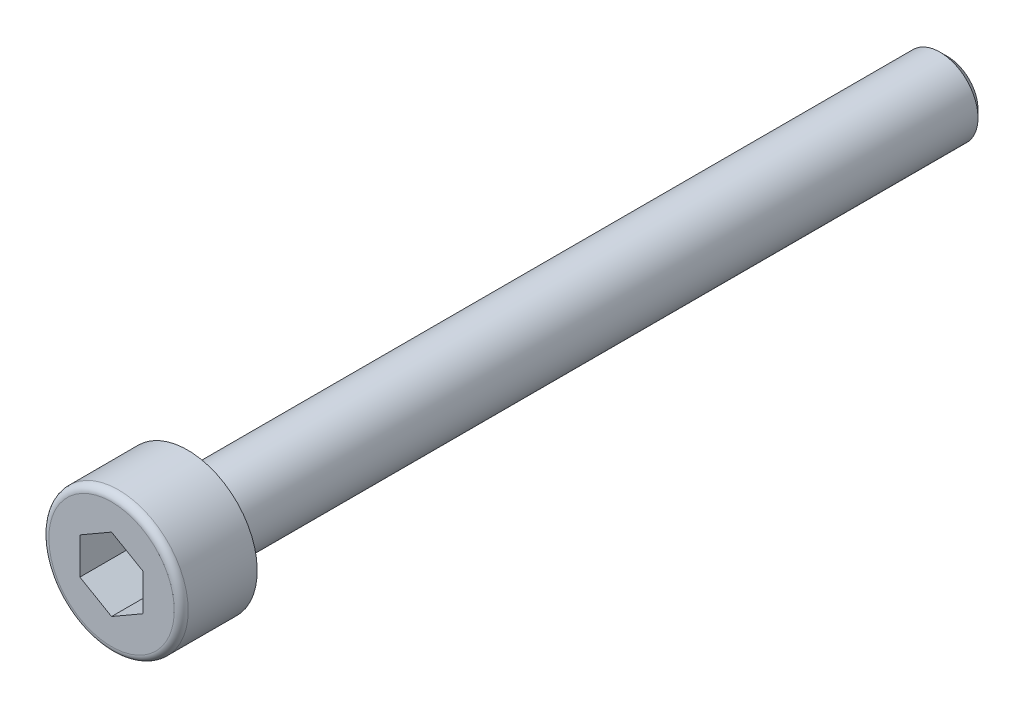
ISO-10303-21;
HEADER;
FILE_DESCRIPTION(('STEP AP214'),'2;1');
FILE_NAME('part.step','',(''),(''),'','','');
FILE_SCHEMA(('AUTOMOTIVE_DESIGN { 1 0 10303 214 1 1 1 1 }'));
ENDSEC;
DATA;
#1=APPLICATION_CONTEXT('core data for automotive mechanical design processes');
#2=APPLICATION_PROTOCOL_DEFINITION('international standard','automotive_design',2000,#1);
#3=PRODUCT_CONTEXT('',#1,'mechanical');
#4=PRODUCT('Part','Part','',(#3));
#5=PRODUCT_RELATED_PRODUCT_CATEGORY('part','',(#4));
#6=PRODUCT_DEFINITION_FORMATION('','',#4);
#7=PRODUCT_DEFINITION_CONTEXT('part definition',#1,'design');
#8=PRODUCT_DEFINITION('design','',#6,#7);
#9=PRODUCT_DEFINITION_SHAPE('','',#8);
#10=(LENGTH_UNIT() NAMED_UNIT(*) SI_UNIT(.MILLI.,.METRE.));
#11=(NAMED_UNIT(*) PLANE_ANGLE_UNIT() SI_UNIT($,.RADIAN.));
#12=(NAMED_UNIT(*) SI_UNIT($,.STERADIAN.) SOLID_ANGLE_UNIT());
#13=UNCERTAINTY_MEASURE_WITH_UNIT(LENGTH_MEASURE(1.E-05),#10,'distance_accuracy_value','');
#14=(GEOMETRIC_REPRESENTATION_CONTEXT(3) GLOBAL_UNCERTAINTY_ASSIGNED_CONTEXT((#13)) GLOBAL_UNIT_ASSIGNED_CONTEXT((#10,
#11,#12)) REPRESENTATION_CONTEXT('',''));
#15=CARTESIAN_POINT('',(0.,0.,0.));
#16=DIRECTION('',(0.,0.,1.));
#17=DIRECTION('',(1.,0.,0.));
#18=AXIS2_PLACEMENT_3D('',#15,#16,#17);
#19=CARTESIAN_POINT('',(0.,0.,3.));
#20=DIRECTION('',(0.,0.,-1.));
#21=DIRECTION('',(0.,1.,0.));
#22=AXIS2_PLACEMENT_3D('',#19,#20,#21);
#23=PLANE('',#22);
#24=CARTESIAN_POINT('',(0.,0.,3.));
#25=DIRECTION('',(0.,0.,-1.));
#26=DIRECTION('',(0.,1.,0.));
#27=AXIS2_PLACEMENT_3D('',#24,#25,#26);
#28=CIRCLE('',#27,2.475);
#29=CARTESIAN_POINT('',(0.,2.475,3.));
#30=VERTEX_POINT('',#29);
#31=EDGE_CURVE('E159',#30,#30,#28,.F.);
#32=ORIENTED_EDGE('',*,*,#31,.T.);
#33=EDGE_LOOP('',(#32));
#34=FACE_BOUND('',#33,.T.);
#35=DIRECTION('',(-0.866025403784439,-0.5,0.));
#36=VECTOR('',#35,1.);
#37=CARTESIAN_POINT('',(0.,1.44337567297406,3.));
#38=LINE('',#37,#36);
#39=CARTESIAN_POINT('',(0.,1.44337567297406,3.));
#40=VERTEX_POINT('',#39);
#41=CARTESIAN_POINT('',(-1.25,0.721687836487032,3.));
#42=VERTEX_POINT('',#41);
#43=EDGE_CURVE('E135',#40,#42,#38,.T.);
#44=ORIENTED_EDGE('',*,*,#43,.F.);
#45=DIRECTION('',(-0.866025403784439,0.5,0.));
#46=VECTOR('',#45,1.);
#47=CARTESIAN_POINT('',(1.25,0.721687836487032,3.));
#48=LINE('',#47,#46);
#49=CARTESIAN_POINT('',(1.25,0.721687836487032,3.));
#50=VERTEX_POINT('',#49);
#51=EDGE_CURVE('E61',#50,#40,#48,.T.);
#52=ORIENTED_EDGE('',*,*,#51,.F.);
#53=DIRECTION('',(0.,1.,0.));
#54=VECTOR('',#53,1.);
#55=CARTESIAN_POINT('',(1.25,-0.721687836487032,3.));
#56=LINE('',#55,#54);
#57=CARTESIAN_POINT('',(1.25,-0.721687836487032,3.));
#58=VERTEX_POINT('',#57);
#59=EDGE_CURVE('E144',#58,#50,#56,.T.);
#60=ORIENTED_EDGE('',*,*,#59,.F.);
#61=DIRECTION('',(0.866025403784439,0.5,0.));
#62=VECTOR('',#61,1.);
#63=CARTESIAN_POINT('',(0.,-1.44337567297406,3.));
#64=LINE('',#63,#62);
#65=CARTESIAN_POINT('',(0.,-1.44337567297406,3.));
#66=VERTEX_POINT('',#65);
#67=EDGE_CURVE('E142',#66,#58,#64,.T.);
#68=ORIENTED_EDGE('',*,*,#67,.F.);
#69=DIRECTION('',(0.866025403784439,-0.5,0.));
#70=VECTOR('',#69,1.);
#71=CARTESIAN_POINT('',(-1.25,-0.721687836487033,3.));
#72=LINE('',#71,#70);
#73=CARTESIAN_POINT('',(-1.25,-0.721687836487033,3.));
#74=VERTEX_POINT('',#73);
#75=EDGE_CURVE('E109',#74,#66,#72,.T.);
#76=ORIENTED_EDGE('',*,*,#75,.F.);
#77=DIRECTION('',(0.,-1.,0.));
#78=VECTOR('',#77,1.);
#79=CARTESIAN_POINT('',(-1.25,0.721687836487032,3.));
#80=LINE('',#79,#78);
#81=EDGE_CURVE('E138',#42,#74,#80,.T.);
#82=ORIENTED_EDGE('',*,*,#81,.F.);
#83=EDGE_LOOP('',(#44,#52,#60,#68,#76,#82));
#84=FACE_BOUND('',#83,.T.);
#85=ADVANCED_FACE('F46',(#34,#84),#23,.F.);
#86=CARTESIAN_POINT('',(0.,0.,3.));
#87=DIRECTION('',(0.,0.,1.));
#88=DIRECTION('',(0.,-1.,0.));
#89=AXIS2_PLACEMENT_3D('',#86,#87,#88);
#90=CYLINDRICAL_SURFACE('',#89,2.75);
#91=CARTESIAN_POINT('',(0.,0.,2.725));
#92=DIRECTION('',(0.,0.,-1.));
#93=DIRECTION('',(0.,1.,0.));
#94=AXIS2_PLACEMENT_3D('',#91,#92,#93);
#95=CIRCLE('',#94,2.75);
#96=CARTESIAN_POINT('',(0.,2.75,2.725));
#97=VERTEX_POINT('',#96);
#98=EDGE_CURVE('E162',#97,#97,#95,.T.);
#99=ORIENTED_EDGE('',*,*,#98,.T.);
#100=EDGE_LOOP('',(#99));
#101=FACE_BOUND('',#100,.T.);
#102=CARTESIAN_POINT('',(0.,0.,0.));
#103=DIRECTION('',(0.,0.,1.));
#104=DIRECTION('',(0.,-1.,0.));
#105=AXIS2_PLACEMENT_3D('',#102,#103,#104);
#106=CIRCLE('',#105,2.75);
#107=CARTESIAN_POINT('',(0.,-2.75,0.));
#108=VERTEX_POINT('',#107);
#109=EDGE_CURVE('E156',#108,#108,#106,.T.);
#110=ORIENTED_EDGE('',*,*,#109,.T.);
#111=EDGE_LOOP('',(#110));
#112=FACE_BOUND('',#111,.T.);
#113=ADVANCED_FACE('F180',(#101,#112),#90,.T.);
#114=CARTESIAN_POINT('',(0.,2.75,0.));
#115=DIRECTION('',(0.,0.,1.));
#116=DIRECTION('',(0.,-1.,0.));
#117=AXIS2_PLACEMENT_3D('',#114,#115,#116);
#118=PLANE('',#117);
#119=ORIENTED_EDGE('',*,*,#109,.F.);
#120=EDGE_LOOP('',(#119));
#121=FACE_BOUND('',#120,.T.);
#122=CARTESIAN_POINT('',(0.,0.,0.));
#123=DIRECTION('',(0.,0.,1.));
#124=DIRECTION('',(0.,-1.,0.));
#125=AXIS2_PLACEMENT_3D('',#122,#123,#124);
#126=CIRCLE('',#125,1.5);
#127=CARTESIAN_POINT('',(0.,-1.5,0.));
#128=VERTEX_POINT('',#127);
#129=EDGE_CURVE('E148',#128,#128,#126,.T.);
#130=ORIENTED_EDGE('',*,*,#129,.T.);
#131=EDGE_LOOP('',(#130));
#132=FACE_BOUND('',#131,.T.);
#133=ADVANCED_FACE('F187',(#121,#132),#118,.F.);
#134=CARTESIAN_POINT('',(0.,0.,3.));
#135=DIRECTION('',(0.,0.,1.));
#136=DIRECTION('',(0.,-1.,0.));
#137=AXIS2_PLACEMENT_3D('',#134,#135,#136);
#138=CYLINDRICAL_SURFACE('',#137,1.5);
#139=CARTESIAN_POINT('',(0.,0.,-29.7));
#140=DIRECTION('',(0.,0.,1.));
#141=DIRECTION('',(0.,-1.,0.));
#142=AXIS2_PLACEMENT_3D('',#139,#140,#141);
#143=CIRCLE('',#142,1.5);
#144=CARTESIAN_POINT('',(0.,-1.5,-29.7));
#145=VERTEX_POINT('',#144);
#146=EDGE_CURVE('E54',#145,#145,#143,.T.);
#147=ORIENTED_EDGE('',*,*,#146,.T.);
#148=EDGE_LOOP('',(#147));
#149=FACE_BOUND('',#148,.T.);
#150=ORIENTED_EDGE('',*,*,#129,.F.);
#151=EDGE_LOOP('',(#150));
#152=FACE_BOUND('',#151,.T.);
#153=ADVANCED_FACE('F167',(#149,#152),#138,.T.);
#154=CARTESIAN_POINT('',(0.,1.5,-30.));
#155=DIRECTION('',(0.,0.,1.));
#156=DIRECTION('',(0.,-1.,0.));
#157=AXIS2_PLACEMENT_3D('',#154,#155,#156);
#158=PLANE('',#157);
#159=CARTESIAN_POINT('',(0.,0.,-30.));
#160=DIRECTION('',(0.,0.,1.));
#161=DIRECTION('',(0.,-1.,0.));
#162=AXIS2_PLACEMENT_3D('',#159,#160,#161);
#163=CIRCLE('',#162,1.20000000000001);
#164=CARTESIAN_POINT('',(0.,-1.20000000000001,-30.));
#165=VERTEX_POINT('',#164);
#166=EDGE_CURVE('E11',#165,#165,#163,.F.);
#167=ORIENTED_EDGE('',*,*,#166,.T.);
#168=EDGE_LOOP('',(#167));
#169=FACE_BOUND('',#168,.T.);
#170=ADVANCED_FACE('F197',(#169),#158,.F.);
#171=CARTESIAN_POINT('',(1.25,0.721687836487032,1.075));
#172=DIRECTION('',(0.5,0.866025403784439,0.));
#173=DIRECTION('',(-0.866025403784439,0.5,0.));
#174=AXIS2_PLACEMENT_3D('',#171,#172,#173);
#175=PLANE('',#174);
#176=ORIENTED_EDGE('',*,*,#51,.T.);
#177=DIRECTION('',(0.,0.,1.));
#178=VECTOR('',#177,1.);
#179=CARTESIAN_POINT('',(0.,1.44337567297406,1.075));
#180=LINE('',#179,#178);
#181=CARTESIAN_POINT('',(0.,1.44337567297406,1.075));
#182=VERTEX_POINT('',#181);
#183=EDGE_CURVE('E91',#182,#40,#180,.T.);
#184=ORIENTED_EDGE('',*,*,#183,.F.);
#185=DIRECTION('',(-0.866025403784439,0.5,0.));
#186=VECTOR('',#185,1.);
#187=CARTESIAN_POINT('',(1.25,0.721687836487032,1.075));
#188=LINE('',#187,#186);
#189=CARTESIAN_POINT('',(1.25,0.721687836487032,1.075));
#190=VERTEX_POINT('',#189);
#191=EDGE_CURVE('E146',#190,#182,#188,.T.);
#192=ORIENTED_EDGE('',*,*,#191,.F.);
#193=DIRECTION('',(0.,0.,1.));
#194=VECTOR('',#193,1.);
#195=CARTESIAN_POINT('',(1.25,0.721687836487032,1.075));
#196=LINE('',#195,#194);
#197=EDGE_CURVE('E69',#190,#50,#196,.T.);
#198=ORIENTED_EDGE('',*,*,#197,.T.);
#199=EDGE_LOOP('',(#176,#184,#192,#198));
#200=FACE_BOUND('',#199,.T.);
#201=ADVANCED_FACE('F199',(#200),#175,.F.);
#202=CARTESIAN_POINT('',(1.25,-0.721687836487032,1.075));
#203=DIRECTION('',(1.,0.,0.));
#204=DIRECTION('',(0.,0.,-1.));
#205=AXIS2_PLACEMENT_3D('',#202,#203,#204);
#206=PLANE('',#205);
#207=ORIENTED_EDGE('',*,*,#59,.T.);
#208=ORIENTED_EDGE('',*,*,#197,.F.);
#209=DIRECTION('',(0.,1.,0.));
#210=VECTOR('',#209,1.);
#211=CARTESIAN_POINT('',(1.25,-0.721687836487032,1.075));
#212=LINE('',#211,#210);
#213=CARTESIAN_POINT('',(1.25,-0.721687836487032,1.075));
#214=VERTEX_POINT('',#213);
#215=EDGE_CURVE('E121',#214,#190,#212,.T.);
#216=ORIENTED_EDGE('',*,*,#215,.F.);
#217=DIRECTION('',(0.,0.,1.));
#218=VECTOR('',#217,1.);
#219=CARTESIAN_POINT('',(1.25,-0.721687836487032,1.075));
#220=LINE('',#219,#218);
#221=EDGE_CURVE('E113',#214,#58,#220,.T.);
#222=ORIENTED_EDGE('',*,*,#221,.T.);
#223=EDGE_LOOP('',(#207,#208,#216,#222));
#224=FACE_BOUND('',#223,.T.);
#225=ADVANCED_FACE('F203',(#224),#206,.F.);
#226=CARTESIAN_POINT('',(0.,-1.44337567297406,1.075));
#227=DIRECTION('',(0.5,-0.866025403784439,0.));
#228=DIRECTION('',(0.866025403784439,0.5,0.));
#229=AXIS2_PLACEMENT_3D('',#226,#227,#228);
#230=PLANE('',#229);
#231=ORIENTED_EDGE('',*,*,#67,.T.);
#232=ORIENTED_EDGE('',*,*,#221,.F.);
#233=DIRECTION('',(0.866025403784439,0.5,0.));
#234=VECTOR('',#233,1.);
#235=CARTESIAN_POINT('',(0.,-1.44337567297406,1.075));
#236=LINE('',#235,#234);
#237=CARTESIAN_POINT('',(0.,-1.44337567297406,1.075));
#238=VERTEX_POINT('',#237);
#239=EDGE_CURVE('E117',#238,#214,#236,.T.);
#240=ORIENTED_EDGE('',*,*,#239,.F.);
#241=DIRECTION('',(0.,0.,1.));
#242=VECTOR('',#241,1.);
#243=CARTESIAN_POINT('',(0.,-1.44337567297406,1.075));
#244=LINE('',#243,#242);
#245=EDGE_CURVE('E102',#238,#66,#244,.T.);
#246=ORIENTED_EDGE('',*,*,#245,.T.);
#247=EDGE_LOOP('',(#231,#232,#240,#246));
#248=FACE_BOUND('',#247,.T.);
#249=ADVANCED_FACE('F118',(#248),#230,.F.);
#250=CARTESIAN_POINT('',(-1.25,-0.721687836487033,1.075));
#251=DIRECTION('',(-0.5,-0.866025403784439,0.));
#252=DIRECTION('',(0.866025403784439,-0.5,0.));
#253=AXIS2_PLACEMENT_3D('',#250,#251,#252);
#254=PLANE('',#253);
#255=ORIENTED_EDGE('',*,*,#75,.T.);
#256=ORIENTED_EDGE('',*,*,#245,.F.);
#257=DIRECTION('',(0.866025403784439,-0.5,0.));
#258=VECTOR('',#257,1.);
#259=CARTESIAN_POINT('',(-1.25,-0.721687836487033,1.075));
#260=LINE('',#259,#258);
#261=CARTESIAN_POINT('',(-1.25,-0.721687836487033,1.075));
#262=VERTEX_POINT('',#261);
#263=EDGE_CURVE('E106',#262,#238,#260,.T.);
#264=ORIENTED_EDGE('',*,*,#263,.F.);
#265=DIRECTION('',(0.,0.,1.));
#266=VECTOR('',#265,1.);
#267=CARTESIAN_POINT('',(-1.25,-0.721687836487033,1.075));
#268=LINE('',#267,#266);
#269=EDGE_CURVE('E114',#262,#74,#268,.T.);
#270=ORIENTED_EDGE('',*,*,#269,.T.);
#271=EDGE_LOOP('',(#255,#256,#264,#270));
#272=FACE_BOUND('',#271,.T.);
#273=ADVANCED_FACE('F104',(#272),#254,.F.);
#274=CARTESIAN_POINT('',(-1.25,0.721687836487032,1.075));
#275=DIRECTION('',(-1.,0.,0.));
#276=DIRECTION('',(0.,-1.,0.));
#277=AXIS2_PLACEMENT_3D('',#274,#275,#276);
#278=PLANE('',#277);
#279=ORIENTED_EDGE('',*,*,#81,.T.);
#280=ORIENTED_EDGE('',*,*,#269,.F.);
#281=DIRECTION('',(0.,-1.,0.));
#282=VECTOR('',#281,1.);
#283=CARTESIAN_POINT('',(-1.25,0.721687836487032,1.075));
#284=LINE('',#283,#282);
#285=CARTESIAN_POINT('',(-1.25,0.721687836487032,1.075));
#286=VERTEX_POINT('',#285);
#287=EDGE_CURVE('E127',#286,#262,#284,.T.);
#288=ORIENTED_EDGE('',*,*,#287,.F.);
#289=DIRECTION('',(0.,0.,1.));
#290=VECTOR('',#289,1.);
#291=CARTESIAN_POINT('',(-1.25,0.721687836487032,1.075));
#292=LINE('',#291,#290);
#293=EDGE_CURVE('E151',#286,#42,#292,.T.);
#294=ORIENTED_EDGE('',*,*,#293,.T.);
#295=EDGE_LOOP('',(#279,#280,#288,#294));
#296=FACE_BOUND('',#295,.T.);
#297=ADVANCED_FACE('F207',(#296),#278,.F.);
#298=CARTESIAN_POINT('',(0.,1.44337567297406,1.075));
#299=DIRECTION('',(-0.5,0.866025403784439,0.));
#300=DIRECTION('',(-0.866025403784439,-0.5,0.));
#301=AXIS2_PLACEMENT_3D('',#298,#299,#300);
#302=PLANE('',#301);
#303=ORIENTED_EDGE('',*,*,#43,.T.);
#304=ORIENTED_EDGE('',*,*,#293,.F.);
#305=DIRECTION('',(-0.866025403784439,-0.5,0.));
#306=VECTOR('',#305,1.);
#307=CARTESIAN_POINT('',(0.,1.44337567297406,1.075));
#308=LINE('',#307,#306);
#309=EDGE_CURVE('E129',#182,#286,#308,.T.);
#310=ORIENTED_EDGE('',*,*,#309,.F.);
#311=ORIENTED_EDGE('',*,*,#183,.T.);
#312=EDGE_LOOP('',(#303,#304,#310,#311));
#313=FACE_BOUND('',#312,.T.);
#314=ADVANCED_FACE('F204',(#313),#302,.F.);
#315=CARTESIAN_POINT('',(0.,1.44337567297406,1.075));
#316=DIRECTION('',(0.,0.,1.));
#317=DIRECTION('',(1.,0.,0.));
#318=AXIS2_PLACEMENT_3D('',#315,#316,#317);
#319=PLANE('',#318);
#320=ORIENTED_EDGE('',*,*,#191,.T.);
#321=ORIENTED_EDGE('',*,*,#309,.T.);
#322=ORIENTED_EDGE('',*,*,#287,.T.);
#323=ORIENTED_EDGE('',*,*,#263,.T.);
#324=ORIENTED_EDGE('',*,*,#239,.T.);
#325=ORIENTED_EDGE('',*,*,#215,.T.);
#326=EDGE_LOOP('',(#320,#321,#322,#323,#324,#325));
#327=FACE_BOUND('',#326,.T.);
#328=ADVANCED_FACE('F124',(#327),#319,.T.);
#329=CARTESIAN_POINT('',(0.,0.,2.725));
#330=DIRECTION('',(0.,0.,-1.));
#331=DIRECTION('',(0.,1.,0.));
#332=AXIS2_PLACEMENT_3D('',#329,#330,#331);
#333=TOROIDAL_SURFACE('',#332,2.475,0.275);
#334=ORIENTED_EDGE('',*,*,#98,.F.);
#335=EDGE_LOOP('',(#334));
#336=FACE_BOUND('',#335,.T.);
#337=ORIENTED_EDGE('',*,*,#31,.F.);
#338=EDGE_LOOP('',(#337));
#339=FACE_BOUND('',#338,.T.);
#340=ADVANCED_FACE('F171',(#336,#339),#333,.T.);
#341=CARTESIAN_POINT('',(0.,0.,-29.7));
#342=DIRECTION('',(0.,0.,1.));
#343=DIRECTION('',(0.,-1.,0.));
#344=AXIS2_PLACEMENT_3D('',#341,#342,#343);
#345=CONICAL_SURFACE('',#344,1.5,0.785398163397452);
#346=ORIENTED_EDGE('',*,*,#166,.F.);
#347=EDGE_LOOP('',(#346));
#348=FACE_BOUND('',#347,.T.);
#349=ORIENTED_EDGE('',*,*,#146,.F.);
#350=EDGE_LOOP('',(#349));
#351=FACE_BOUND('',#350,.T.);
#352=ADVANCED_FACE('F48',(#348,#351),#345,.T.);
#353=CLOSED_SHELL('',(#85,#113,#133,#153,#170,#201,#225,#249,#273,#297,#314,#328,#340,#352));
#354=MANIFOLD_SOLID_BREP('B2',#353);
#355=ADVANCED_BREP_SHAPE_REPRESENTATION('',(#18,#354),#14);
#356=SHAPE_DEFINITION_REPRESENTATION(#9,#355);
ENDSEC;
END-ISO-10303-21;
